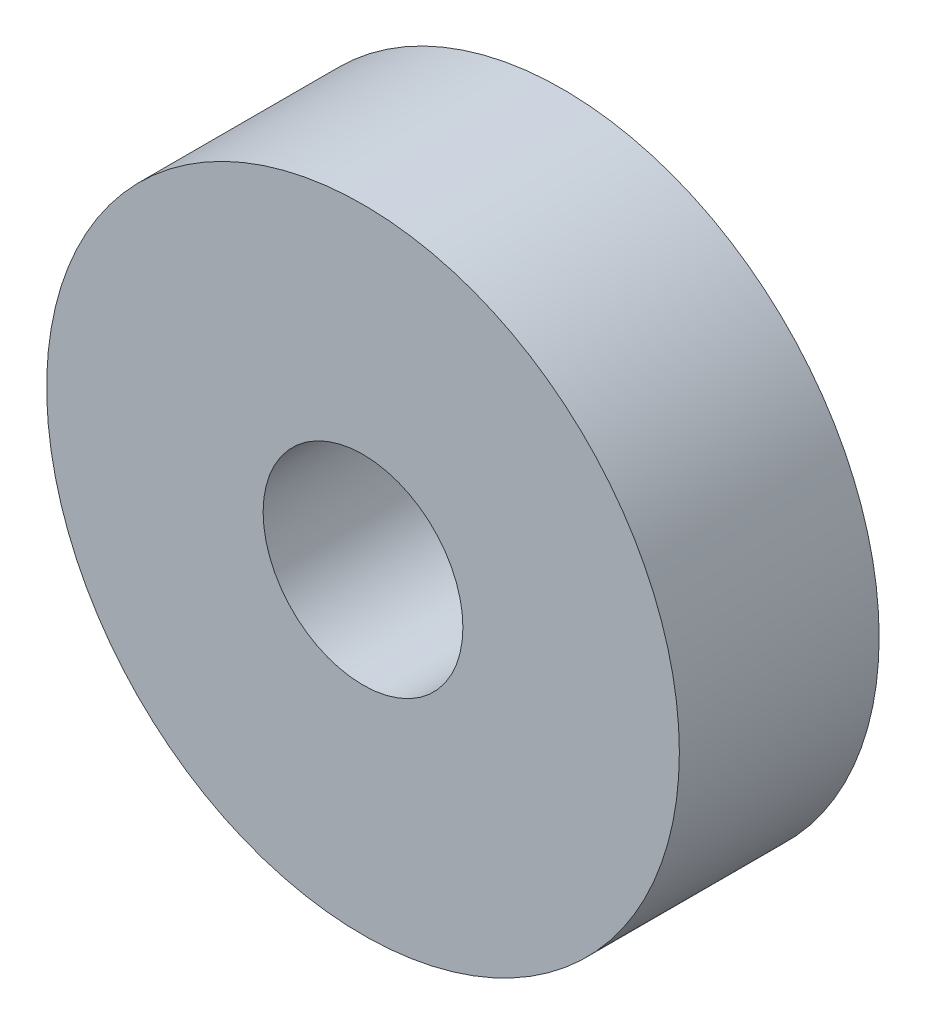
ISO-10303-21;
HEADER;
FILE_DESCRIPTION(('STEP AP214'),'2;1');
FILE_NAME('part.step','',(''),(''),'','','');
FILE_SCHEMA(('AUTOMOTIVE_DESIGN { 1 0 10303 214 1 1 1 1 }'));
ENDSEC;
DATA;
#1=APPLICATION_CONTEXT('core data for automotive mechanical design processes');
#2=APPLICATION_PROTOCOL_DEFINITION('international standard','automotive_design',2000,#1);
#3=PRODUCT_CONTEXT('',#1,'mechanical');
#4=PRODUCT('Part','Part','',(#3));
#5=PRODUCT_RELATED_PRODUCT_CATEGORY('part','',(#4));
#6=PRODUCT_DEFINITION_FORMATION('','',#4);
#7=PRODUCT_DEFINITION_CONTEXT('part definition',#1,'design');
#8=PRODUCT_DEFINITION('design','',#6,#7);
#9=PRODUCT_DEFINITION_SHAPE('','',#8);
#10=(LENGTH_UNIT() NAMED_UNIT(*) SI_UNIT(.MILLI.,.METRE.));
#11=(NAMED_UNIT(*) PLANE_ANGLE_UNIT() SI_UNIT($,.RADIAN.));
#12=(NAMED_UNIT(*) SI_UNIT($,.STERADIAN.) SOLID_ANGLE_UNIT());
#13=UNCERTAINTY_MEASURE_WITH_UNIT(LENGTH_MEASURE(1.E-05),#10,'distance_accuracy_value','');
#14=(GEOMETRIC_REPRESENTATION_CONTEXT(3) GLOBAL_UNCERTAINTY_ASSIGNED_CONTEXT((#13)) GLOBAL_UNIT_ASSIGNED_CONTEXT((#10,
#11,#12)) REPRESENTATION_CONTEXT('',''));
#15=CARTESIAN_POINT('',(0.,0.,0.));
#16=DIRECTION('',(0.,0.,1.));
#17=DIRECTION('',(1.,0.,0.));
#18=AXIS2_PLACEMENT_3D('',#15,#16,#17);
#19=CARTESIAN_POINT('',(0.,0.,6.));
#20=DIRECTION('',(0.,0.,1.));
#21=DIRECTION('',(1.,0.,0.));
#22=AXIS2_PLACEMENT_3D('',#19,#20,#21);
#23=PLANE('',#22);
#24=CARTESIAN_POINT('',(0.,0.,6.));
#25=DIRECTION('',(0.,0.,1.));
#26=DIRECTION('',(1.,0.,0.));
#27=AXIS2_PLACEMENT_3D('',#24,#25,#26);
#28=CIRCLE('',#27,9.5);
#29=CARTESIAN_POINT('',(9.5,0.,6.));
#30=VERTEX_POINT('',#29);
#31=EDGE_CURVE('E10',#30,#30,#28,.T.);
#32=ORIENTED_EDGE('',*,*,#31,.T.);
#33=EDGE_LOOP('',(#32));
#34=FACE_BOUND('',#33,.T.);
#35=CARTESIAN_POINT('',(0.,0.,6.));
#36=DIRECTION('',(0.,0.,1.));
#37=DIRECTION('',(1.,0.,0.));
#38=AXIS2_PLACEMENT_3D('',#35,#36,#37);
#39=CIRCLE('',#38,3.);
#40=CARTESIAN_POINT('',(3.,0.,6.));
#41=VERTEX_POINT('',#40);
#42=EDGE_CURVE('E50',#41,#41,#39,.T.);
#43=ORIENTED_EDGE('',*,*,#42,.F.);
#44=EDGE_LOOP('',(#43));
#45=FACE_BOUND('',#44,.T.);
#46=ADVANCED_FACE('F37',(#34,#45),#23,.T.);
#47=CARTESIAN_POINT('',(0.,0.,0.));
#48=DIRECTION('',(0.,0.,1.));
#49=DIRECTION('',(1.,0.,0.));
#50=AXIS2_PLACEMENT_3D('',#47,#48,#49);
#51=PLANE('',#50);
#52=CARTESIAN_POINT('',(0.,0.,0.));
#53=DIRECTION('',(0.,0.,1.));
#54=DIRECTION('',(1.,0.,0.));
#55=AXIS2_PLACEMENT_3D('',#52,#53,#54);
#56=CIRCLE('',#55,9.5);
#57=CARTESIAN_POINT('',(9.5,0.,0.));
#58=VERTEX_POINT('',#57);
#59=EDGE_CURVE('E41',#58,#58,#56,.T.);
#60=ORIENTED_EDGE('',*,*,#59,.F.);
#61=EDGE_LOOP('',(#60));
#62=FACE_BOUND('',#61,.T.);
#63=CARTESIAN_POINT('',(0.,0.,0.));
#64=DIRECTION('',(0.,0.,1.));
#65=DIRECTION('',(1.,0.,0.));
#66=AXIS2_PLACEMENT_3D('',#63,#64,#65);
#67=CIRCLE('',#66,3.);
#68=CARTESIAN_POINT('',(3.,0.,0.));
#69=VERTEX_POINT('',#68);
#70=EDGE_CURVE('E52',#69,#69,#67,.T.);
#71=ORIENTED_EDGE('',*,*,#70,.T.);
#72=EDGE_LOOP('',(#71));
#73=FACE_BOUND('',#72,.T.);
#74=ADVANCED_FACE('F64',(#62,#73),#51,.F.);
#75=CARTESIAN_POINT('',(0.,0.,6.));
#76=DIRECTION('',(0.,0.,-1.));
#77=DIRECTION('',(-1.,0.,0.));
#78=AXIS2_PLACEMENT_3D('',#75,#76,#77);
#79=CYLINDRICAL_SURFACE('',#78,9.5);
#80=ORIENTED_EDGE('',*,*,#31,.F.);
#81=EDGE_LOOP('',(#80));
#82=FACE_BOUND('',#81,.T.);
#83=ORIENTED_EDGE('',*,*,#59,.T.);
#84=EDGE_LOOP('',(#83));
#85=FACE_BOUND('',#84,.T.);
#86=ADVANCED_FACE('F39',(#82,#85),#79,.T.);
#87=CARTESIAN_POINT('',(0.,0.,6.));
#88=DIRECTION('',(0.,0.,-1.));
#89=DIRECTION('',(-1.,0.,0.));
#90=AXIS2_PLACEMENT_3D('',#87,#88,#89);
#91=CYLINDRICAL_SURFACE('',#90,3.);
#92=ORIENTED_EDGE('',*,*,#42,.T.);
#93=EDGE_LOOP('',(#92));
#94=FACE_BOUND('',#93,.T.);
#95=ORIENTED_EDGE('',*,*,#70,.F.);
#96=EDGE_LOOP('',(#95));
#97=FACE_BOUND('',#96,.T.);
#98=ADVANCED_FACE('F60',(#94,#97),#91,.F.);
#99=CLOSED_SHELL('',(#46,#74,#86,#98));
#100=MANIFOLD_SOLID_BREP('B2',#99);
#101=ADVANCED_BREP_SHAPE_REPRESENTATION('',(#18,#100),#14);
#102=SHAPE_DEFINITION_REPRESENTATION(#9,#101);
ENDSEC;
END-ISO-10303-21;
